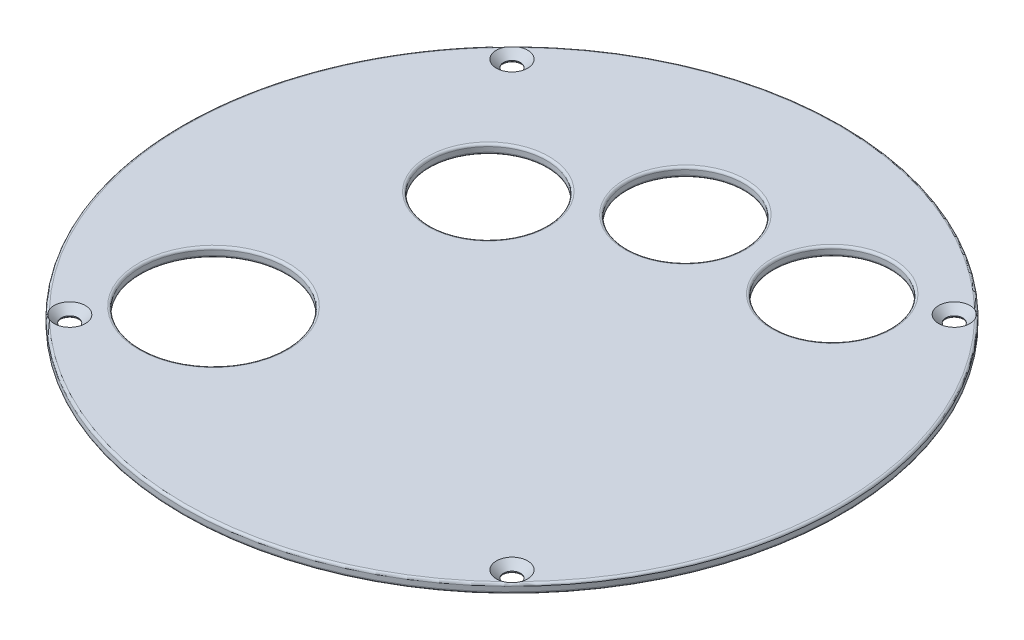
ISO-10303-21;
HEADER;
FILE_DESCRIPTION(('STEP AP214'),'2;1');
FILE_NAME('part.step','',(''),(''),'','','');
FILE_SCHEMA(('AUTOMOTIVE_DESIGN { 1 0 10303 214 1 1 1 1 }'));
ENDSEC;
DATA;
#1=APPLICATION_CONTEXT('core data for automotive mechanical design processes');
#2=APPLICATION_PROTOCOL_DEFINITION('international standard','automotive_design',2000,#1);
#3=PRODUCT_CONTEXT('',#1,'mechanical');
#4=PRODUCT('Part','Part','',(#3));
#5=PRODUCT_RELATED_PRODUCT_CATEGORY('part','',(#4));
#6=PRODUCT_DEFINITION_FORMATION('','',#4);
#7=PRODUCT_DEFINITION_CONTEXT('part definition',#1,'design');
#8=PRODUCT_DEFINITION('design','',#6,#7);
#9=PRODUCT_DEFINITION_SHAPE('','',#8);
#10=(LENGTH_UNIT() NAMED_UNIT(*) SI_UNIT(.MILLI.,.METRE.));
#11=(NAMED_UNIT(*) PLANE_ANGLE_UNIT() SI_UNIT($,.RADIAN.));
#12=(NAMED_UNIT(*) SI_UNIT($,.STERADIAN.) SOLID_ANGLE_UNIT());
#13=UNCERTAINTY_MEASURE_WITH_UNIT(LENGTH_MEASURE(1.E-05),#10,'distance_accuracy_value','');
#14=(GEOMETRIC_REPRESENTATION_CONTEXT(3) GLOBAL_UNCERTAINTY_ASSIGNED_CONTEXT((#13)) GLOBAL_UNIT_ASSIGNED_CONTEXT((#10,
#11,#12)) REPRESENTATION_CONTEXT('',''));
#15=CARTESIAN_POINT('',(0.,0.,0.));
#16=DIRECTION('',(0.,0.,1.));
#17=DIRECTION('',(1.,0.,0.));
#18=AXIS2_PLACEMENT_3D('',#15,#16,#17);
#19=CARTESIAN_POINT('',(-25.,2.,-20.));
#20=DIRECTION('',(0.,-1.,0.));
#21=DIRECTION('',(0.,0.,-1.));
#22=AXIS2_PLACEMENT_3D('',#19,#20,#21);
#23=CYLINDRICAL_SURFACE('',#22,12.3);
#24=CARTESIAN_POINT('',(-25.,0.5,-20.));
#25=DIRECTION('',(0.,1.,0.));
#26=DIRECTION('',(0.,0.,1.));
#27=AXIS2_PLACEMENT_3D('',#24,#25,#26);
#28=CIRCLE('',#27,12.3);
#29=CARTESIAN_POINT('',(-25.,0.5,-7.69999999999999));
#30=VERTEX_POINT('',#29);
#31=EDGE_CURVE('E145',#30,#30,#28,.F.);
#32=ORIENTED_EDGE('',*,*,#31,.T.);
#33=EDGE_LOOP('',(#32));
#34=FACE_BOUND('',#33,.T.);
#35=CARTESIAN_POINT('',(-25.,1.5,-20.));
#36=DIRECTION('',(0.,1.,0.));
#37=DIRECTION('',(0.,0.,1.));
#38=AXIS2_PLACEMENT_3D('',#35,#36,#37);
#39=CIRCLE('',#38,12.3);
#40=CARTESIAN_POINT('',(-25.,1.5,-7.69999999999999));
#41=VERTEX_POINT('',#40);
#42=EDGE_CURVE('E138',#41,#41,#39,.T.);
#43=ORIENTED_EDGE('',*,*,#42,.T.);
#44=EDGE_LOOP('',(#43));
#45=FACE_BOUND('',#44,.T.);
#46=ADVANCED_FACE('F43',(#34,#45),#23,.F.);
#47=CARTESIAN_POINT('',(0.,2.,-36.583123951777));
#48=DIRECTION('',(0.,-1.,0.));
#49=DIRECTION('',(0.,0.,-1.));
#50=AXIS2_PLACEMENT_3D('',#47,#48,#49);
#51=CYLINDRICAL_SURFACE('',#50,12.3);
#52=CARTESIAN_POINT('',(0.,0.5,-36.583123951777));
#53=DIRECTION('',(0.,1.,0.));
#54=DIRECTION('',(0.,0.,1.));
#55=AXIS2_PLACEMENT_3D('',#52,#53,#54);
#56=CIRCLE('',#55,12.3);
#57=CARTESIAN_POINT('',(0.,0.5,-24.283123951777));
#58=VERTEX_POINT('',#57);
#59=EDGE_CURVE('E139',#58,#58,#56,.F.);
#60=ORIENTED_EDGE('',*,*,#59,.T.);
#61=EDGE_LOOP('',(#60));
#62=FACE_BOUND('',#61,.T.);
#63=CARTESIAN_POINT('',(0.,1.5,-36.583123951777));
#64=DIRECTION('',(0.,1.,0.));
#65=DIRECTION('',(0.,0.,1.));
#66=AXIS2_PLACEMENT_3D('',#63,#64,#65);
#67=CIRCLE('',#66,12.3);
#68=CARTESIAN_POINT('',(0.,1.5,-24.283123951777));
#69=VERTEX_POINT('',#68);
#70=EDGE_CURVE('E134',#69,#69,#67,.T.);
#71=ORIENTED_EDGE('',*,*,#70,.T.);
#72=EDGE_LOOP('',(#71));
#73=FACE_BOUND('',#72,.T.);
#74=ADVANCED_FACE('F238',(#62,#73),#51,.F.);
#75=CARTESIAN_POINT('',(30.,2.,-37.583123951777));
#76=DIRECTION('',(0.,-1.,0.));
#77=DIRECTION('',(0.,0.,-1.));
#78=AXIS2_PLACEMENT_3D('',#75,#76,#77);
#79=CYLINDRICAL_SURFACE('',#78,12.3);
#80=CARTESIAN_POINT('',(30.,0.5,-37.583123951777));
#81=DIRECTION('',(0.,1.,0.));
#82=DIRECTION('',(0.,0.,1.));
#83=AXIS2_PLACEMENT_3D('',#80,#81,#82);
#84=CIRCLE('',#83,12.3);
#85=CARTESIAN_POINT('',(30.,0.5,-25.283123951777));
#86=VERTEX_POINT('',#85);
#87=EDGE_CURVE('E129',#86,#86,#84,.F.);
#88=ORIENTED_EDGE('',*,*,#87,.T.);
#89=EDGE_LOOP('',(#88));
#90=FACE_BOUND('',#89,.T.);
#91=CARTESIAN_POINT('',(30.,1.5,-37.583123951777));
#92=DIRECTION('',(0.,1.,0.));
#93=DIRECTION('',(0.,0.,1.));
#94=AXIS2_PLACEMENT_3D('',#91,#92,#93);
#95=CIRCLE('',#94,12.3);
#96=CARTESIAN_POINT('',(30.,1.5,-25.283123951777));
#97=VERTEX_POINT('',#96);
#98=EDGE_CURVE('E130',#97,#97,#95,.T.);
#99=ORIENTED_EDGE('',*,*,#98,.T.);
#100=EDGE_LOOP('',(#99));
#101=FACE_BOUND('',#100,.T.);
#102=ADVANCED_FACE('F242',(#90,#101),#79,.F.);
#103=CARTESIAN_POINT('',(-33.,2.,30.));
#104=DIRECTION('',(0.,-1.,0.));
#105=DIRECTION('',(0.,0.,-1.));
#106=AXIS2_PLACEMENT_3D('',#103,#104,#105);
#107=CYLINDRICAL_SURFACE('',#106,15.3);
#108=CARTESIAN_POINT('',(-33.,0.5,30.));
#109=DIRECTION('',(0.,1.,0.));
#110=DIRECTION('',(0.,0.,1.));
#111=AXIS2_PLACEMENT_3D('',#108,#109,#110);
#112=CIRCLE('',#111,15.3);
#113=CARTESIAN_POINT('',(-33.,0.5,45.3));
#114=VERTEX_POINT('',#113);
#115=EDGE_CURVE('E105',#114,#114,#112,.F.);
#116=ORIENTED_EDGE('',*,*,#115,.T.);
#117=EDGE_LOOP('',(#116));
#118=FACE_BOUND('',#117,.T.);
#119=CARTESIAN_POINT('',(-33.,1.5,30.));
#120=DIRECTION('',(0.,1.,0.));
#121=DIRECTION('',(0.,0.,1.));
#122=AXIS2_PLACEMENT_3D('',#119,#120,#121);
#123=CIRCLE('',#122,15.3);
#124=CARTESIAN_POINT('',(-33.,1.5,45.3));
#125=VERTEX_POINT('',#124);
#126=EDGE_CURVE('E110',#125,#125,#123,.T.);
#127=ORIENTED_EDGE('',*,*,#126,.T.);
#128=EDGE_LOOP('',(#127));
#129=FACE_BOUND('',#128,.T.);
#130=ADVANCED_FACE('F251',(#118,#129),#107,.F.);
#131=CARTESIAN_POINT('',(0.,2.,0.));
#132=DIRECTION('',(0.,-1.,0.));
#133=DIRECTION('',(0.,0.,-1.));
#134=AXIS2_PLACEMENT_3D('',#131,#132,#133);
#135=CYLINDRICAL_SURFACE('',#134,69.55);
#136=CARTESIAN_POINT('',(0.,0.5,0.));
#137=DIRECTION('',(0.,1.,0.));
#138=DIRECTION('',(0.,0.,1.));
#139=AXIS2_PLACEMENT_3D('',#136,#137,#138);
#140=CIRCLE('',#139,69.55);
#141=CARTESIAN_POINT('',(0.,0.5,69.55));
#142=VERTEX_POINT('',#141);
#143=EDGE_CURVE('E147',#142,#142,#140,.T.);
#144=ORIENTED_EDGE('',*,*,#143,.T.);
#145=EDGE_LOOP('',(#144));
#146=FACE_BOUND('',#145,.T.);
#147=CARTESIAN_POINT('',(0.,1.5,0.));
#148=DIRECTION('',(0.,1.,0.));
#149=DIRECTION('',(0.,0.,1.));
#150=AXIS2_PLACEMENT_3D('',#147,#148,#149);
#151=CIRCLE('',#150,69.55);
#152=CARTESIAN_POINT('',(0.,1.5,69.55));
#153=VERTEX_POINT('',#152);
#154=EDGE_CURVE('E143',#153,#153,#151,.F.);
#155=ORIENTED_EDGE('',*,*,#154,.T.);
#156=EDGE_LOOP('',(#155));
#157=FACE_BOUND('',#156,.T.);
#158=ADVANCED_FACE('F248',(#146,#157),#135,.T.);
#159=CARTESIAN_POINT('',(0.,2.,0.));
#160=DIRECTION('',(0.,1.,0.));
#161=DIRECTION('',(0.,0.,1.));
#162=AXIS2_PLACEMENT_3D('',#159,#160,#161);
#163=PLANE('',#162);
#164=CARTESIAN_POINT('',(-33.,2.,30.));
#165=DIRECTION('',(0.,1.,0.));
#166=DIRECTION('',(0.,0.,1.));
#167=AXIS2_PLACEMENT_3D('',#164,#165,#166);
#168=CIRCLE('',#167,15.8);
#169=CARTESIAN_POINT('',(-33.,2.,45.8));
#170=VERTEX_POINT('',#169);
#171=EDGE_CURVE('E121',#170,#170,#168,.F.);
#172=ORIENTED_EDGE('',*,*,#171,.T.);
#173=EDGE_LOOP('',(#172));
#174=FACE_BOUND('',#173,.T.);
#175=CARTESIAN_POINT('',(30.,2.,-37.583123951777));
#176=DIRECTION('',(0.,1.,0.));
#177=DIRECTION('',(0.,0.,1.));
#178=AXIS2_PLACEMENT_3D('',#175,#176,#177);
#179=CIRCLE('',#178,12.8);
#180=CARTESIAN_POINT('',(30.,2.,-24.783123951777));
#181=VERTEX_POINT('',#180);
#182=EDGE_CURVE('E122',#181,#181,#179,.F.);
#183=ORIENTED_EDGE('',*,*,#182,.T.);
#184=EDGE_LOOP('',(#183));
#185=FACE_BOUND('',#184,.T.);
#186=CARTESIAN_POINT('',(0.,2.,-36.583123951777));
#187=DIRECTION('',(0.,1.,0.));
#188=DIRECTION('',(0.,0.,1.));
#189=AXIS2_PLACEMENT_3D('',#186,#187,#188);
#190=CIRCLE('',#189,12.8);
#191=CARTESIAN_POINT('',(0.,2.,-23.783123951777));
#192=VERTEX_POINT('',#191);
#193=EDGE_CURVE('E117',#192,#192,#190,.F.);
#194=ORIENTED_EDGE('',*,*,#193,.T.);
#195=EDGE_LOOP('',(#194));
#196=FACE_BOUND('',#195,.T.);
#197=CARTESIAN_POINT('',(-25.,2.,-20.));
#198=DIRECTION('',(0.,1.,0.));
#199=DIRECTION('',(0.,0.,1.));
#200=AXIS2_PLACEMENT_3D('',#197,#198,#199);
#201=CIRCLE('',#200,12.8);
#202=CARTESIAN_POINT('',(-25.,2.,-7.19999999999999));
#203=VERTEX_POINT('',#202);
#204=EDGE_CURVE('E114',#203,#203,#201,.F.);
#205=ORIENTED_EDGE('',*,*,#204,.T.);
#206=EDGE_LOOP('',(#205));
#207=FACE_BOUND('',#206,.T.);
#208=CARTESIAN_POINT('',(46.669047558312,2.,-46.6690475583122));
#209=DIRECTION('',(0.,1.,0.));
#210=DIRECTION('',(0.,0.,1.));
#211=AXIS2_PLACEMENT_3D('',#208,#209,#210);
#212=CIRCLE('',#211,3.29999999999994);
#213=CARTESIAN_POINT('',(49.7284593285276,2.,-47.9059790924993));
#214=VERTEX_POINT('',#213);
#215=CARTESIAN_POINT('',(47.9059790924991,2.,-49.7284593285278));
#216=VERTEX_POINT('',#215);
#217=EDGE_CURVE('E339',#214,#216,#212,.F.);
#218=ORIENTED_EDGE('',*,*,#217,.T.);
#219=CARTESIAN_POINT('',(0.,2.,0.));
#220=DIRECTION('',(0.,1.,0.));
#221=DIRECTION('',(0.,0.,1.));
#222=AXIS2_PLACEMENT_3D('',#219,#220,#221);
#223=CIRCLE('',#222,69.05);
#224=CARTESIAN_POINT('',(-47.9059790924992,2.,-49.7284593285276));
#225=VERTEX_POINT('',#224);
#226=EDGE_CURVE('E115',#216,#225,#223,.T.);
#227=ORIENTED_EDGE('',*,*,#226,.T.);
#228=CARTESIAN_POINT('',(-46.6690475583122,2.,-46.669047558312));
#229=DIRECTION('',(0.,1.,0.));
#230=DIRECTION('',(0.,0.,1.));
#231=AXIS2_PLACEMENT_3D('',#228,#229,#230);
#232=CIRCLE('',#231,3.3);
#233=CARTESIAN_POINT('',(-49.7284593285279,2.,-47.905979092499));
#234=VERTEX_POINT('',#233);
#235=EDGE_CURVE('E337',#225,#234,#232,.F.);
#236=ORIENTED_EDGE('',*,*,#235,.T.);
#237=CARTESIAN_POINT('',(0.,2.,0.));
#238=DIRECTION('',(0.,1.,0.));
#239=DIRECTION('',(0.,0.,1.));
#240=AXIS2_PLACEMENT_3D('',#237,#238,#239);
#241=CIRCLE('',#240,69.05);
#242=CARTESIAN_POINT('',(-49.7284593285277,2.,47.9059790924992));
#243=VERTEX_POINT('',#242);
#244=EDGE_CURVE('E104',#234,#243,#241,.T.);
#245=ORIENTED_EDGE('',*,*,#244,.T.);
#246=CARTESIAN_POINT('',(-46.669047558312,2.,46.6690475583122));
#247=DIRECTION('',(0.,1.,0.));
#248=DIRECTION('',(0.,0.,1.));
#249=AXIS2_PLACEMENT_3D('',#246,#247,#248);
#250=CIRCLE('',#249,3.3);
#251=CARTESIAN_POINT('',(-47.905979092499,2.,49.7284593285278));
#252=VERTEX_POINT('',#251);
#253=EDGE_CURVE('E100',#243,#252,#250,.F.);
#254=ORIENTED_EDGE('',*,*,#253,.T.);
#255=CARTESIAN_POINT('',(0.,2.,0.));
#256=DIRECTION('',(0.,1.,0.));
#257=DIRECTION('',(0.,0.,1.));
#258=AXIS2_PLACEMENT_3D('',#255,#256,#257);
#259=CIRCLE('',#258,69.05);
#260=CARTESIAN_POINT('',(47.9059790924992,2.,49.7284593285276));
#261=VERTEX_POINT('',#260);
#262=EDGE_CURVE('E97',#252,#261,#259,.T.);
#263=ORIENTED_EDGE('',*,*,#262,.T.);
#264=CARTESIAN_POINT('',(46.6690475583122,2.,46.669047558312));
#265=DIRECTION('',(0.,1.,0.));
#266=DIRECTION('',(0.,0.,1.));
#267=AXIS2_PLACEMENT_3D('',#264,#265,#266);
#268=CIRCLE('',#267,3.3);
#269=CARTESIAN_POINT('',(49.7284593285279,2.,47.905979092499));
#270=VERTEX_POINT('',#269);
#271=EDGE_CURVE('E94',#261,#270,#268,.F.);
#272=ORIENTED_EDGE('',*,*,#271,.T.);
#273=CARTESIAN_POINT('',(0.,2.,0.));
#274=DIRECTION('',(0.,1.,0.));
#275=DIRECTION('',(0.,0.,1.));
#276=AXIS2_PLACEMENT_3D('',#273,#274,#275);
#277=CIRCLE('',#276,69.05);
#278=EDGE_CURVE('E63',#270,#214,#277,.T.);
#279=ORIENTED_EDGE('',*,*,#278,.T.);
#280=EDGE_LOOP('',(#218,#227,#236,#245,#254,#263,#272,#279));
#281=FACE_BOUND('',#280,.T.);
#282=ADVANCED_FACE('F92',(#174,#185,#196,#207,#281),#163,.T.);
#283=CARTESIAN_POINT('',(0.,0.,0.));
#284=DIRECTION('',(0.,1.,0.));
#285=DIRECTION('',(0.,0.,1.));
#286=AXIS2_PLACEMENT_3D('',#283,#284,#285);
#287=PLANE('',#286);
#288=CARTESIAN_POINT('',(-46.6690475583122,0.,-46.669047558312));
#289=DIRECTION('',(0.,1.,0.));
#290=DIRECTION('',(0.,0.,1.));
#291=AXIS2_PLACEMENT_3D('',#288,#289,#290);
#292=CIRCLE('',#291,2.3);
#293=CARTESIAN_POINT('',(-46.6690475583122,0.,-44.369047558312));
#294=VERTEX_POINT('',#293);
#295=EDGE_CURVE('E282',#294,#294,#292,.T.);
#296=ORIENTED_EDGE('',*,*,#295,.T.);
#297=EDGE_LOOP('',(#296));
#298=FACE_BOUND('',#297,.T.);
#299=CARTESIAN_POINT('',(46.669047558312,0.,-46.6690475583122));
#300=DIRECTION('',(0.,1.,0.));
#301=DIRECTION('',(0.,0.,1.));
#302=AXIS2_PLACEMENT_3D('',#299,#300,#301);
#303=CIRCLE('',#302,2.29999999999999);
#304=CARTESIAN_POINT('',(46.669047558312,0.,-44.3690475583123));
#305=VERTEX_POINT('',#304);
#306=EDGE_CURVE('E289',#305,#305,#303,.T.);
#307=ORIENTED_EDGE('',*,*,#306,.T.);
#308=EDGE_LOOP('',(#307));
#309=FACE_BOUND('',#308,.T.);
#310=CARTESIAN_POINT('',(46.6690475583122,0.,46.669047558312));
#311=DIRECTION('',(0.,1.,0.));
#312=DIRECTION('',(0.,0.,1.));
#313=AXIS2_PLACEMENT_3D('',#310,#311,#312);
#314=CIRCLE('',#313,2.3);
#315=CARTESIAN_POINT('',(46.6690475583122,0.,48.969047558312));
#316=VERTEX_POINT('',#315);
#317=EDGE_CURVE('E287',#316,#316,#314,.T.);
#318=ORIENTED_EDGE('',*,*,#317,.T.);
#319=EDGE_LOOP('',(#318));
#320=FACE_BOUND('',#319,.T.);
#321=CARTESIAN_POINT('',(-46.669047558312,0.,46.6690475583122));
#322=DIRECTION('',(0.,1.,0.));
#323=DIRECTION('',(0.,0.,1.));
#324=AXIS2_PLACEMENT_3D('',#321,#322,#323);
#325=CIRCLE('',#324,2.3);
#326=CARTESIAN_POINT('',(-46.669047558312,0.,48.9690475583122));
#327=VERTEX_POINT('',#326);
#328=EDGE_CURVE('E295',#327,#327,#325,.T.);
#329=ORIENTED_EDGE('',*,*,#328,.T.);
#330=EDGE_LOOP('',(#329));
#331=FACE_BOUND('',#330,.T.);
#332=CARTESIAN_POINT('',(-33.,0.,30.));
#333=DIRECTION('',(0.,1.,0.));
#334=DIRECTION('',(0.,0.,1.));
#335=AXIS2_PLACEMENT_3D('',#332,#333,#334);
#336=CIRCLE('',#335,15.8);
#337=CARTESIAN_POINT('',(-33.,0.,45.8));
#338=VERTEX_POINT('',#337);
#339=EDGE_CURVE('E296',#338,#338,#336,.T.);
#340=ORIENTED_EDGE('',*,*,#339,.T.);
#341=EDGE_LOOP('',(#340));
#342=FACE_BOUND('',#341,.T.);
#343=CARTESIAN_POINT('',(30.,0.,-37.583123951777));
#344=DIRECTION('',(0.,1.,0.));
#345=DIRECTION('',(0.,0.,1.));
#346=AXIS2_PLACEMENT_3D('',#343,#344,#345);
#347=CIRCLE('',#346,12.8);
#348=CARTESIAN_POINT('',(30.,0.,-24.783123951777));
#349=VERTEX_POINT('',#348);
#350=EDGE_CURVE('E305',#349,#349,#347,.T.);
#351=ORIENTED_EDGE('',*,*,#350,.T.);
#352=EDGE_LOOP('',(#351));
#353=FACE_BOUND('',#352,.T.);
#354=CARTESIAN_POINT('',(0.,0.,-36.583123951777));
#355=DIRECTION('',(0.,1.,0.));
#356=DIRECTION('',(0.,0.,1.));
#357=AXIS2_PLACEMENT_3D('',#354,#355,#356);
#358=CIRCLE('',#357,12.8);
#359=CARTESIAN_POINT('',(0.,0.,-23.783123951777));
#360=VERTEX_POINT('',#359);
#361=EDGE_CURVE('E306',#360,#360,#358,.T.);
#362=ORIENTED_EDGE('',*,*,#361,.T.);
#363=EDGE_LOOP('',(#362));
#364=FACE_BOUND('',#363,.T.);
#365=CARTESIAN_POINT('',(-25.,0.,-20.));
#366=DIRECTION('',(0.,1.,0.));
#367=DIRECTION('',(0.,0.,1.));
#368=AXIS2_PLACEMENT_3D('',#365,#366,#367);
#369=CIRCLE('',#368,12.8);
#370=CARTESIAN_POINT('',(-25.,0.,-7.19999999999999));
#371=VERTEX_POINT('',#370);
#372=EDGE_CURVE('E309',#371,#371,#369,.T.);
#373=ORIENTED_EDGE('',*,*,#372,.T.);
#374=EDGE_LOOP('',(#373));
#375=FACE_BOUND('',#374,.T.);
#376=CARTESIAN_POINT('',(0.,0.,0.));
#377=DIRECTION('',(0.,1.,0.));
#378=DIRECTION('',(0.,0.,1.));
#379=AXIS2_PLACEMENT_3D('',#376,#377,#378);
#380=CIRCLE('',#379,69.05);
#381=CARTESIAN_POINT('',(0.,0.,69.05));
#382=VERTEX_POINT('',#381);
#383=EDGE_CURVE('E315',#382,#382,#380,.F.);
#384=ORIENTED_EDGE('',*,*,#383,.T.);
#385=EDGE_LOOP('',(#384));
#386=FACE_BOUND('',#385,.T.);
#387=ADVANCED_FACE('F264',(#298,#309,#320,#331,#342,#353,#364,#375,#386),#287,.F.);
#388=CARTESIAN_POINT('',(46.6690475583122,0.499999999999998,46.669047558312));
#389=DIRECTION('',(0.,1.,0.));
#390=DIRECTION('',(0.,0.,1.));
#391=AXIS2_PLACEMENT_3D('',#388,#389,#390);
#392=CONICAL_SURFACE('',#391,1.8,0.785398163397446);
#393=ORIENTED_EDGE('',*,*,#271,.F.);
#394=CARTESIAN_POINT('',(47.9059790924992,2.,49.7284593285276));
#395=CARTESIAN_POINT('',(47.9369280073174,1.9999822337835,49.7159277756934));
#396=CARTESIAN_POINT('',(47.967507588771,1.99953549361961,49.7025355959407));
#397=CARTESIAN_POINT('',(48.0279448745487,1.99802870380179,49.6742932681616));
#398=CARTESIAN_POINT('',(48.0578031151832,1.99696912538322,49.6594442476339));
#399=CARTESIAN_POINT('',(48.1167903023262,1.99448353830433,49.6285689870253));
#400=CARTESIAN_POINT('',(48.1459208419281,1.99305842455753,49.6125456893232));
#401=CARTESIAN_POINT('',(48.2035711528134,1.9899955731709,49.5794446073993));
#402=CARTESIAN_POINT('',(48.2320907855841,1.98835778789365,49.5623665873755));
#403=CARTESIAN_POINT('',(48.3171027673089,1.98330099482566,49.5095468166972));
#404=CARTESIAN_POINT('',(48.3727164317481,1.97975562827056,49.4723964251357));
#405=CARTESIAN_POINT('',(48.4818363847848,1.97302623030698,49.3950273432038));
#406=CARTESIAN_POINT('',(48.5353408046894,1.96984251480669,49.354806020825));
#407=CARTESIAN_POINT('',(48.6804214687594,1.96218452259889,49.2400629982064));
#408=CARTESIAN_POINT('',(48.7698877142012,1.95857984207532,49.1627920464817));
#409=CARTESIAN_POINT('',(48.9426923460604,1.95516916327022,49.0015653497562));
#410=CARTESIAN_POINT('',(49.0260276735308,1.95536504850428,48.9176063107453));
#411=CARTESIAN_POINT('',(49.1856973538339,1.95949371432797,48.7438111819625));
#412=CARTESIAN_POINT('',(49.2620533133104,1.96341450196816,48.6539948149171));
#413=CARTESIAN_POINT('',(49.3703699696109,1.97106500520324,48.5146311447609));
#414=CARTESIAN_POINT('',(49.4054273692547,1.97390866740326,48.4674219054263));
#415=CARTESIAN_POINT('',(49.4731574419545,1.97984739721364,48.3713435040079));
#416=CARTESIAN_POINT('',(49.5058304848881,1.98294242567229,48.3224746011135));
#417=CARTESIAN_POINT('',(49.5737942490766,1.98945453925593,48.2142676138722));
#418=CARTESIAN_POINT('',(49.6085525072063,1.99283406669731,48.1545864988989));
#419=CARTESIAN_POINT('',(49.6568212942465,1.99677432231953,48.0630047582933));
#420=CARTESIAN_POINT('',(49.6722607272347,1.99789934401152,48.0321469040299));
#421=CARTESIAN_POINT('',(49.7015946034568,1.9995034332586,47.9696527844697));
#422=CARTESIAN_POINT('',(49.7154874053797,1.99998182047907,47.9380157349348));
#423=CARTESIAN_POINT('',(49.7284593285286,2.00000000000093,47.9059790924995));
#424=B_SPLINE_CURVE_WITH_KNOTS('',3,(#394,#395,#396,#397,#398,#399,#400,#401,#402,#403,#404,
#405,#406,#407,#408,#409,#410,#411,#412,#413,#414,#415,#416,#417,#418,#419,#420,#421,#422,#423),
.UNSPECIFIED.,.F.,.F.,(4,2,2,2,2,2,2,2,2,2,2,2,2,2,4),(0.,0.100125819314969,0.200174750124725,
0.299981038261936,0.399809721226055,0.600594056740244,0.801552453478836,1.15588906808548,
1.51040129222605,1.86377595918188,2.04033141024901,2.21685941434954,2.4240776650579,
2.52760411392848,2.63123940009638),.UNSPECIFIED.);
#425=EDGE_CURVE('E60',#261,#270,#424,.T.);
#426=ORIENTED_EDGE('',*,*,#425,.T.);
#427=EDGE_LOOP('',(#393,#426));
#428=FACE_BOUND('',#427,.T.);
#429=CARTESIAN_POINT('',(46.6690475583122,0.499999999999998,46.669047558312));
#430=DIRECTION('',(0.,1.,0.));
#431=DIRECTION('',(0.,0.,1.));
#432=AXIS2_PLACEMENT_3D('',#429,#430,#431);
#433=CIRCLE('',#432,1.8);
#434=CARTESIAN_POINT('',(46.6690475583122,0.499999999999998,48.469047558312));
#435=VERTEX_POINT('',#434);
#436=EDGE_CURVE('E341',#435,#435,#433,.T.);
#437=ORIENTED_EDGE('',*,*,#436,.F.);
#438=EDGE_LOOP('',(#437));
#439=FACE_BOUND('',#438,.T.);
#440=ADVANCED_FACE('F88',(#428,#439),#392,.F.);
#441=CARTESIAN_POINT('',(-46.669047558312,0.499999999999998,46.6690475583122));
#442=DIRECTION('',(0.,1.,0.));
#443=DIRECTION('',(0.,0.,1.));
#444=AXIS2_PLACEMENT_3D('',#441,#442,#443);
#445=CONICAL_SURFACE('',#444,1.8,0.785398163397446);
#446=ORIENTED_EDGE('',*,*,#253,.F.);
#447=CARTESIAN_POINT('',(-49.7284593285277,2.,47.9059790924992));
#448=CARTESIAN_POINT('',(-49.7159277756934,1.99998223378349,47.9369280073174));
#449=CARTESIAN_POINT('',(-49.7025355959407,1.99953549361961,47.967507588771));
#450=CARTESIAN_POINT('',(-49.6742932681616,1.99802870380179,48.0279448745487));
#451=CARTESIAN_POINT('',(-49.659444247634,1.99696912538322,48.0578031151832));
#452=CARTESIAN_POINT('',(-49.6285689870253,1.99448353830433,48.1167903023262));
#453=CARTESIAN_POINT('',(-49.6125456893232,1.99305842455753,48.1459208419281));
#454=CARTESIAN_POINT('',(-49.5794446073993,1.9899955731709,48.2035711528134));
#455=CARTESIAN_POINT('',(-49.5623665873755,1.98835778789365,48.232090785584));
#456=CARTESIAN_POINT('',(-49.5095468166972,1.98330099482566,48.3171027673089));
#457=CARTESIAN_POINT('',(-49.4723964251357,1.97975562827056,48.3727164317481));
#458=CARTESIAN_POINT('',(-49.3950273432038,1.97302623030698,48.4818363847847));
#459=CARTESIAN_POINT('',(-49.3548060208251,1.96984251480669,48.5353408046894));
#460=CARTESIAN_POINT('',(-49.2400629982064,1.96218452259888,48.6804214687594));
#461=CARTESIAN_POINT('',(-49.1627920464817,1.95857984207532,48.7698877142012));
#462=CARTESIAN_POINT('',(-49.0015653497562,1.95516916327022,48.9426923460604));
#463=CARTESIAN_POINT('',(-48.9176063107453,1.95536504850428,49.0260276735308));
#464=CARTESIAN_POINT('',(-48.7438111819626,1.95949371432797,49.1856973538339));
#465=CARTESIAN_POINT('',(-48.6539948149172,1.96341450196816,49.2620533133104));
#466=CARTESIAN_POINT('',(-48.514631144761,1.97106500520324,49.3703699696108));
#467=CARTESIAN_POINT('',(-48.4674219054263,1.97390866740325,49.4054273692547));
#468=CARTESIAN_POINT('',(-48.371343504008,1.97984739721364,49.4731574419544));
#469=CARTESIAN_POINT('',(-48.3224746011136,1.98294242567228,49.505830484888));
#470=CARTESIAN_POINT('',(-48.2142676138723,1.98945453925592,49.5737942490765));
#471=CARTESIAN_POINT('',(-48.154586498899,1.9928340666973,49.6085525072062));
#472=CARTESIAN_POINT('',(-48.0630047582933,1.99677432231953,49.6568212942464));
#473=CARTESIAN_POINT('',(-48.03214690403,1.99789934401152,49.6722607272347));
#474=CARTESIAN_POINT('',(-47.9696527844697,1.9995034332586,49.7015946034568));
#475=CARTESIAN_POINT('',(-47.9380157349348,1.99998182047907,49.7154874053797));
#476=CARTESIAN_POINT('',(-47.9059790924996,2.00000000000093,49.7284593285286));
#477=B_SPLINE_CURVE_WITH_KNOTS('',3,(#447,#448,#449,#450,#451,#452,#453,#454,#455,#456,#457,
#458,#459,#460,#461,#462,#463,#464,#465,#466,#467,#468,#469,#470,#471,#472,#473,#474,#475,#476),
.UNSPECIFIED.,.F.,.F.,(4,2,2,2,2,2,2,2,2,2,2,2,2,2,4),(0.,0.100125819314969,0.200174750124725,
0.299981038261936,0.399809721226055,0.60059405674024,0.801552453478836,1.15588906808545,
1.51040129222598,1.86377595918179,2.04033141024892,2.21685941434943,2.42407766505784,
2.52760411392846,2.63123940009638),.UNSPECIFIED.);
#478=EDGE_CURVE('E93',#243,#252,#477,.T.);
#479=ORIENTED_EDGE('',*,*,#478,.T.);
#480=EDGE_LOOP('',(#446,#479));
#481=FACE_BOUND('',#480,.T.);
#482=CARTESIAN_POINT('',(-46.669047558312,0.499999999999998,46.6690475583122));
#483=DIRECTION('',(0.,1.,0.));
#484=DIRECTION('',(0.,0.,1.));
#485=AXIS2_PLACEMENT_3D('',#482,#483,#484);
#486=CIRCLE('',#485,1.8);
#487=CARTESIAN_POINT('',(-46.669047558312,0.499999999999998,48.4690475583122));
#488=VERTEX_POINT('',#487);
#489=EDGE_CURVE('E96',#488,#488,#486,.T.);
#490=ORIENTED_EDGE('',*,*,#489,.F.);
#491=EDGE_LOOP('',(#490));
#492=FACE_BOUND('',#491,.T.);
#493=ADVANCED_FACE('F175',(#481,#492),#445,.F.);
#494=CARTESIAN_POINT('',(-46.6690475583122,0.499999999999998,-46.669047558312));
#495=DIRECTION('',(0.,1.,0.));
#496=DIRECTION('',(0.,0.,1.));
#497=AXIS2_PLACEMENT_3D('',#494,#495,#496);
#498=CONICAL_SURFACE('',#497,1.8,0.785398163397446);
#499=ORIENTED_EDGE('',*,*,#235,.F.);
#500=CARTESIAN_POINT('',(-47.9059790924992,2.,-49.7284593285276));
#501=CARTESIAN_POINT('',(-47.9369280073174,1.9999822337835,-49.7159277756934));
#502=CARTESIAN_POINT('',(-47.967507588771,1.99953549361962,-49.7025355959407));
#503=CARTESIAN_POINT('',(-48.0279448745487,1.99802870380179,-49.6742932681616));
#504=CARTESIAN_POINT('',(-48.0578031151832,1.99696912538322,-49.659444247634));
#505=CARTESIAN_POINT('',(-48.1167903023262,1.99448353830433,-49.6285689870253));
#506=CARTESIAN_POINT('',(-48.1459208419281,1.99305842455753,-49.6125456893232));
#507=CARTESIAN_POINT('',(-48.2035711528134,1.9899955731709,-49.5794446073993));
#508=CARTESIAN_POINT('',(-48.232090785584,1.98835778789365,-49.5623665873755));
#509=CARTESIAN_POINT('',(-48.3171027673089,1.98330099482567,-49.5095468166972));
#510=CARTESIAN_POINT('',(-48.3727164317481,1.97975562827056,-49.4723964251357));
#511=CARTESIAN_POINT('',(-48.4818363847847,1.97302623030698,-49.3950273432038));
#512=CARTESIAN_POINT('',(-48.5353408046894,1.96984251480669,-49.3548060208251));
#513=CARTESIAN_POINT('',(-48.6804214687594,1.96218452259888,-49.2400629982064));
#514=CARTESIAN_POINT('',(-48.7698877142012,1.95857984207532,-49.1627920464817));
#515=CARTESIAN_POINT('',(-48.9426923460604,1.95516916327022,-49.0015653497562));
#516=CARTESIAN_POINT('',(-49.0260276735308,1.95536504850428,-48.9176063107453));
#517=CARTESIAN_POINT('',(-49.1856973538339,1.95949371432797,-48.7438111819626));
#518=CARTESIAN_POINT('',(-49.2620533133104,1.96341450196816,-48.6539948149172));
#519=CARTESIAN_POINT('',(-49.3703699696108,1.97106500520324,-48.514631144761));
#520=CARTESIAN_POINT('',(-49.4054273692547,1.97390866740326,-48.4674219054263));
#521=CARTESIAN_POINT('',(-49.4731574419544,1.97984739721364,-48.371343504008));
#522=CARTESIAN_POINT('',(-49.505830484888,1.98294242567228,-48.3224746011136));
#523=CARTESIAN_POINT('',(-49.5737942490765,1.98945453925592,-48.2142676138723));
#524=CARTESIAN_POINT('',(-49.6085525072062,1.9928340666973,-48.154586498899));
#525=CARTESIAN_POINT('',(-49.6568212942465,1.99677432231953,-48.0630047582933));
#526=CARTESIAN_POINT('',(-49.6722607272347,1.99789934401152,-48.03214690403));
#527=CARTESIAN_POINT('',(-49.7015946034568,1.9995034332586,-47.9696527844697));
#528=CARTESIAN_POINT('',(-49.7154874053797,1.99998182047907,-47.9380157349348));
#529=CARTESIAN_POINT('',(-49.7284593285286,2.00000000000093,-47.9059790924995));
#530=B_SPLINE_CURVE_WITH_KNOTS('',3,(#500,#501,#502,#503,#504,#505,#506,#507,#508,#509,#510,
#511,#512,#513,#514,#515,#516,#517,#518,#519,#520,#521,#522,#523,#524,#525,#526,#527,#528,#529),
.UNSPECIFIED.,.F.,.F.,(4,2,2,2,2,2,2,2,2,2,2,2,2,2,4),(0.,0.100125819314966,0.200174750124719,
0.299981038261937,0.399809721226045,0.600594056740231,0.801552453478827,1.15588906808545,
1.51040129222598,1.86377595918179,2.04033141024892,2.21685941434943,2.42407766505784,
2.52760411392845,2.63123940009638),.UNSPECIFIED.);
#531=EDGE_CURVE('E151',#225,#234,#530,.T.);
#532=ORIENTED_EDGE('',*,*,#531,.T.);
#533=EDGE_LOOP('',(#499,#532));
#534=FACE_BOUND('',#533,.T.);
#535=CARTESIAN_POINT('',(-46.6690475583122,0.499999999999998,-46.669047558312));
#536=DIRECTION('',(0.,1.,0.));
#537=DIRECTION('',(0.,0.,1.));
#538=AXIS2_PLACEMENT_3D('',#535,#536,#537);
#539=CIRCLE('',#538,1.8);
#540=CARTESIAN_POINT('',(-46.6690475583122,0.499999999999998,-44.869047558312));
#541=VERTEX_POINT('',#540);
#542=EDGE_CURVE('E320',#541,#541,#539,.T.);
#543=ORIENTED_EDGE('',*,*,#542,.F.);
#544=EDGE_LOOP('',(#543));
#545=FACE_BOUND('',#544,.T.);
#546=ADVANCED_FACE('F165',(#534,#545),#498,.F.);
#547=CARTESIAN_POINT('',(46.669047558312,0.500000000000038,-46.6690475583122));
#548=DIRECTION('',(0.,1.,0.));
#549=DIRECTION('',(0.,0.,1.));
#550=AXIS2_PLACEMENT_3D('',#547,#548,#549);
#551=CONICAL_SURFACE('',#550,1.79999999999999,0.785398163397446);
#552=ORIENTED_EDGE('',*,*,#217,.F.);
#553=CARTESIAN_POINT('',(49.7284593285276,2.,-47.9059790924993));
#554=CARTESIAN_POINT('',(49.7159277756933,1.9999822337835,-47.9369280073175));
#555=CARTESIAN_POINT('',(49.7025355959406,1.99953549361962,-47.9675075887711));
#556=CARTESIAN_POINT('',(49.6742932681615,1.99802870380179,-48.0279448745488));
#557=CARTESIAN_POINT('',(49.6594442476339,1.99696912538322,-48.0578031151833));
#558=CARTESIAN_POINT('',(49.6285689870252,1.99448353830433,-48.1167903023263));
#559=CARTESIAN_POINT('',(49.6125456893231,1.99305842455753,-48.1459208419282));
#560=CARTESIAN_POINT('',(49.5794446073992,1.9899955731709,-48.2035711528135));
#561=CARTESIAN_POINT('',(49.5623665873754,1.98835778789365,-48.2320907855842));
#562=CARTESIAN_POINT('',(49.5095468166971,1.98330099482567,-48.317102767309));
#563=CARTESIAN_POINT('',(49.4723964251356,1.97975562827056,-48.3727164317482));
#564=CARTESIAN_POINT('',(49.3950273432036,1.97302623030698,-48.4818363847849));
#565=CARTESIAN_POINT('',(49.3548060208249,1.96984251480669,-48.5353408046896));
#566=CARTESIAN_POINT('',(49.2400629982062,1.9621845225989,-48.6804214687595));
#567=CARTESIAN_POINT('',(49.1627920464815,1.95857984207533,-48.7698877142013));
#568=CARTESIAN_POINT('',(49.001565349756,1.95516916327024,-48.9426923460605));
#569=CARTESIAN_POINT('',(48.9176063107451,1.9553650485043,-49.0260276735309));
#570=CARTESIAN_POINT('',(48.7438111819624,1.95949371432799,-49.185697353834));
#571=CARTESIAN_POINT('',(48.653994814917,1.96341450196818,-49.2620533133105));
#572=CARTESIAN_POINT('',(48.5146311447608,1.97106500520326,-49.3703699696109));
#573=CARTESIAN_POINT('',(48.4674219054261,1.97390866740328,-49.4054273692548));
#574=CARTESIAN_POINT('',(48.3713435040078,1.97984739721366,-49.4731574419545));
#575=CARTESIAN_POINT('',(48.3224746011134,1.98294242567231,-49.5058304848881));
#576=CARTESIAN_POINT('',(48.2142676138721,1.98945453925594,-49.5737942490766));
#577=CARTESIAN_POINT('',(48.1545864988989,1.99283406669731,-49.6085525072062));
#578=CARTESIAN_POINT('',(48.0630047582933,1.99677432231954,-49.6568212942464));
#579=CARTESIAN_POINT('',(48.0321469040299,1.99789934401152,-49.6722607272346));
#580=CARTESIAN_POINT('',(47.9696527844698,1.9995034332586,-49.7015946034567));
#581=CARTESIAN_POINT('',(47.9380157349349,1.99998182047907,-49.7154874053796));
#582=CARTESIAN_POINT('',(47.9059790924996,2.00000000000093,-49.7284593285285));
#583=B_SPLINE_CURVE_WITH_KNOTS('',3,(#553,#554,#555,#556,#557,#558,#559,#560,#561,#562,#563,
#564,#565,#566,#567,#568,#569,#570,#571,#572,#573,#574,#575,#576,#577,#578,#579,#580,#581,#582),
.UNSPECIFIED.,.F.,.F.,(4,2,2,2,2,2,2,2,2,2,2,2,2,2,4),(0.,0.100125819314969,0.200174750124737,
0.299981038261958,0.399809721226092,0.600594056740299,0.801552453478923,1.15588906808553,
1.51040129222606,1.86377595918187,2.040331410249,2.21685941434951,2.42407766505774,
2.52760411392825,2.63123940009609),.UNSPECIFIED.);
#584=EDGE_CURVE('E11',#214,#216,#583,.T.);
#585=ORIENTED_EDGE('',*,*,#584,.T.);
#586=EDGE_LOOP('',(#552,#585));
#587=FACE_BOUND('',#586,.T.);
#588=CARTESIAN_POINT('',(46.669047558312,0.500000000000038,-46.6690475583122));
#589=DIRECTION('',(0.,1.,0.));
#590=DIRECTION('',(0.,0.,1.));
#591=AXIS2_PLACEMENT_3D('',#588,#589,#590);
#592=CIRCLE('',#591,1.79999999999999);
#593=CARTESIAN_POINT('',(46.669047558312,0.500000000000038,-44.8690475583122));
#594=VERTEX_POINT('',#593);
#595=EDGE_CURVE('E312',#594,#594,#592,.T.);
#596=ORIENTED_EDGE('',*,*,#595,.F.);
#597=EDGE_LOOP('',(#596));
#598=FACE_BOUND('',#597,.T.);
#599=ADVANCED_FACE('F171',(#587,#598),#551,.F.);
#600=CARTESIAN_POINT('',(-46.6690475583122,0.5,-46.669047558312));
#601=DIRECTION('',(0.,1.,0.));
#602=DIRECTION('',(0.,0.,1.));
#603=AXIS2_PLACEMENT_3D('',#600,#601,#602);
#604=TOROIDAL_SURFACE('',#603,2.3,0.5);
#605=ORIENTED_EDGE('',*,*,#542,.T.);
#606=EDGE_LOOP('',(#605));
#607=FACE_BOUND('',#606,.T.);
#608=ORIENTED_EDGE('',*,*,#295,.F.);
#609=EDGE_LOOP('',(#608));
#610=FACE_BOUND('',#609,.T.);
#611=ADVANCED_FACE('F181',(#607,#610),#604,.T.);
#612=CARTESIAN_POINT('',(46.669047558312,0.5,-46.6690475583122));
#613=DIRECTION('',(0.,1.,0.));
#614=DIRECTION('',(0.,0.,1.));
#615=AXIS2_PLACEMENT_3D('',#612,#613,#614);
#616=TOROIDAL_SURFACE('',#615,2.29999999999999,0.5);
#617=ORIENTED_EDGE('',*,*,#595,.T.);
#618=EDGE_LOOP('',(#617));
#619=FACE_BOUND('',#618,.T.);
#620=ORIENTED_EDGE('',*,*,#306,.F.);
#621=EDGE_LOOP('',(#620));
#622=FACE_BOUND('',#621,.T.);
#623=ADVANCED_FACE('F183',(#619,#622),#616,.T.);
#624=CARTESIAN_POINT('',(46.6690475583122,0.5,46.669047558312));
#625=DIRECTION('',(0.,1.,0.));
#626=DIRECTION('',(0.,0.,1.));
#627=AXIS2_PLACEMENT_3D('',#624,#625,#626);
#628=TOROIDAL_SURFACE('',#627,2.3,0.5);
#629=ORIENTED_EDGE('',*,*,#436,.T.);
#630=EDGE_LOOP('',(#629));
#631=FACE_BOUND('',#630,.T.);
#632=ORIENTED_EDGE('',*,*,#317,.F.);
#633=EDGE_LOOP('',(#632));
#634=FACE_BOUND('',#633,.T.);
#635=ADVANCED_FACE('F189',(#631,#634),#628,.T.);
#636=CARTESIAN_POINT('',(-46.669047558312,0.5,46.6690475583122));
#637=DIRECTION('',(0.,1.,0.));
#638=DIRECTION('',(0.,0.,1.));
#639=AXIS2_PLACEMENT_3D('',#636,#637,#638);
#640=TOROIDAL_SURFACE('',#639,2.3,0.5);
#641=ORIENTED_EDGE('',*,*,#489,.T.);
#642=EDGE_LOOP('',(#641));
#643=FACE_BOUND('',#642,.T.);
#644=ORIENTED_EDGE('',*,*,#328,.F.);
#645=EDGE_LOOP('',(#644));
#646=FACE_BOUND('',#645,.T.);
#647=ADVANCED_FACE('F195',(#643,#646),#640,.T.);
#648=CARTESIAN_POINT('',(-33.,0.5,30.));
#649=DIRECTION('',(0.,1.,0.));
#650=DIRECTION('',(0.,0.,1.));
#651=AXIS2_PLACEMENT_3D('',#648,#649,#650);
#652=TOROIDAL_SURFACE('',#651,15.8,0.5);
#653=ORIENTED_EDGE('',*,*,#115,.F.);
#654=EDGE_LOOP('',(#653));
#655=FACE_BOUND('',#654,.T.);
#656=ORIENTED_EDGE('',*,*,#339,.F.);
#657=EDGE_LOOP('',(#656));
#658=FACE_BOUND('',#657,.T.);
#659=ADVANCED_FACE('F196',(#655,#658),#652,.T.);
#660=CARTESIAN_POINT('',(-33.,1.5,30.));
#661=DIRECTION('',(0.,1.,0.));
#662=DIRECTION('',(0.,0.,1.));
#663=AXIS2_PLACEMENT_3D('',#660,#661,#662);
#664=TOROIDAL_SURFACE('',#663,15.8,0.5);
#665=ORIENTED_EDGE('',*,*,#171,.F.);
#666=EDGE_LOOP('',(#665));
#667=FACE_BOUND('',#666,.T.);
#668=ORIENTED_EDGE('',*,*,#126,.F.);
#669=EDGE_LOOP('',(#668));
#670=FACE_BOUND('',#669,.T.);
#671=ADVANCED_FACE('F200',(#667,#670),#664,.T.);
#672=CARTESIAN_POINT('',(30.,0.5,-37.583123951777));
#673=DIRECTION('',(0.,1.,0.));
#674=DIRECTION('',(0.,0.,1.));
#675=AXIS2_PLACEMENT_3D('',#672,#673,#674);
#676=TOROIDAL_SURFACE('',#675,12.8,0.5);
#677=ORIENTED_EDGE('',*,*,#87,.F.);
#678=EDGE_LOOP('',(#677));
#679=FACE_BOUND('',#678,.T.);
#680=ORIENTED_EDGE('',*,*,#350,.F.);
#681=EDGE_LOOP('',(#680));
#682=FACE_BOUND('',#681,.T.);
#683=ADVANCED_FACE('F203',(#679,#682),#676,.T.);
#684=CARTESIAN_POINT('',(30.,1.5,-37.583123951777));
#685=DIRECTION('',(0.,1.,0.));
#686=DIRECTION('',(0.,0.,1.));
#687=AXIS2_PLACEMENT_3D('',#684,#685,#686);
#688=TOROIDAL_SURFACE('',#687,12.8,0.5);
#689=ORIENTED_EDGE('',*,*,#182,.F.);
#690=EDGE_LOOP('',(#689));
#691=FACE_BOUND('',#690,.T.);
#692=ORIENTED_EDGE('',*,*,#98,.F.);
#693=EDGE_LOOP('',(#692));
#694=FACE_BOUND('',#693,.T.);
#695=ADVANCED_FACE('F206',(#691,#694),#688,.T.);
#696=CARTESIAN_POINT('',(0.,0.5,-36.583123951777));
#697=DIRECTION('',(0.,1.,0.));
#698=DIRECTION('',(0.,0.,1.));
#699=AXIS2_PLACEMENT_3D('',#696,#697,#698);
#700=TOROIDAL_SURFACE('',#699,12.8,0.5);
#701=ORIENTED_EDGE('',*,*,#59,.F.);
#702=EDGE_LOOP('',(#701));
#703=FACE_BOUND('',#702,.T.);
#704=ORIENTED_EDGE('',*,*,#361,.F.);
#705=EDGE_LOOP('',(#704));
#706=FACE_BOUND('',#705,.T.);
#707=ADVANCED_FACE('F215',(#703,#706),#700,.T.);
#708=CARTESIAN_POINT('',(0.,1.5,-36.583123951777));
#709=DIRECTION('',(0.,1.,0.));
#710=DIRECTION('',(0.,0.,1.));
#711=AXIS2_PLACEMENT_3D('',#708,#709,#710);
#712=TOROIDAL_SURFACE('',#711,12.8,0.5);
#713=ORIENTED_EDGE('',*,*,#193,.F.);
#714=EDGE_LOOP('',(#713));
#715=FACE_BOUND('',#714,.T.);
#716=ORIENTED_EDGE('',*,*,#70,.F.);
#717=EDGE_LOOP('',(#716));
#718=FACE_BOUND('',#717,.T.);
#719=ADVANCED_FACE('F216',(#715,#718),#712,.T.);
#720=CARTESIAN_POINT('',(-25.,0.5,-20.));
#721=DIRECTION('',(0.,1.,0.));
#722=DIRECTION('',(0.,0.,1.));
#723=AXIS2_PLACEMENT_3D('',#720,#721,#722);
#724=TOROIDAL_SURFACE('',#723,12.8,0.5);
#725=ORIENTED_EDGE('',*,*,#31,.F.);
#726=EDGE_LOOP('',(#725));
#727=FACE_BOUND('',#726,.T.);
#728=ORIENTED_EDGE('',*,*,#372,.F.);
#729=EDGE_LOOP('',(#728));
#730=FACE_BOUND('',#729,.T.);
#731=ADVANCED_FACE('F220',(#727,#730),#724,.T.);
#732=CARTESIAN_POINT('',(-25.,1.5,-20.));
#733=DIRECTION('',(0.,1.,0.));
#734=DIRECTION('',(0.,0.,1.));
#735=AXIS2_PLACEMENT_3D('',#732,#733,#734);
#736=TOROIDAL_SURFACE('',#735,12.8,0.5);
#737=ORIENTED_EDGE('',*,*,#204,.F.);
#738=EDGE_LOOP('',(#737));
#739=FACE_BOUND('',#738,.T.);
#740=ORIENTED_EDGE('',*,*,#42,.F.);
#741=EDGE_LOOP('',(#740));
#742=FACE_BOUND('',#741,.T.);
#743=ADVANCED_FACE('F223',(#739,#742),#736,.T.);
#744=CARTESIAN_POINT('',(0.,0.5,0.));
#745=DIRECTION('',(0.,1.,0.));
#746=DIRECTION('',(0.,0.,1.));
#747=AXIS2_PLACEMENT_3D('',#744,#745,#746);
#748=TOROIDAL_SURFACE('',#747,69.05,0.5);
#749=ORIENTED_EDGE('',*,*,#383,.F.);
#750=EDGE_LOOP('',(#749));
#751=FACE_BOUND('',#750,.T.);
#752=ORIENTED_EDGE('',*,*,#143,.F.);
#753=EDGE_LOOP('',(#752));
#754=FACE_BOUND('',#753,.T.);
#755=ADVANCED_FACE('F227',(#751,#754),#748,.T.);
#756=CARTESIAN_POINT('',(0.,1.5,0.));
#757=DIRECTION('',(0.,1.,0.));
#758=DIRECTION('',(0.,0.,1.));
#759=AXIS2_PLACEMENT_3D('',#756,#757,#758);
#760=TOROIDAL_SURFACE('',#759,69.05,0.5);
#761=ORIENTED_EDGE('',*,*,#154,.F.);
#762=EDGE_LOOP('',(#761));
#763=FACE_BOUND('',#762,.T.);
#764=ORIENTED_EDGE('',*,*,#531,.F.);
#765=ORIENTED_EDGE('',*,*,#226,.F.);
#766=ORIENTED_EDGE('',*,*,#584,.F.);
#767=ORIENTED_EDGE('',*,*,#278,.F.);
#768=ORIENTED_EDGE('',*,*,#425,.F.);
#769=ORIENTED_EDGE('',*,*,#262,.F.);
#770=ORIENTED_EDGE('',*,*,#478,.F.);
#771=ORIENTED_EDGE('',*,*,#244,.F.);
#772=EDGE_LOOP('',(#764,#765,#766,#767,#768,#769,#770,#771));
#773=FACE_BOUND('',#772,.T.);
#774=ADVANCED_FACE('F44',(#763,#773),#760,.T.);
#775=CLOSED_SHELL('',(#46,#74,#102,#130,#158,#282,#387,#440,#493,#546,#599,#611,#623,#635,#647,
#659,#671,#683,#695,#707,#719,#731,#743,#755,#774));
#776=MANIFOLD_SOLID_BREP('B2',#775);
#777=ADVANCED_BREP_SHAPE_REPRESENTATION('',(#18,#776),#14);
#778=SHAPE_DEFINITION_REPRESENTATION(#9,#777);
ENDSEC;
END-ISO-10303-21;
